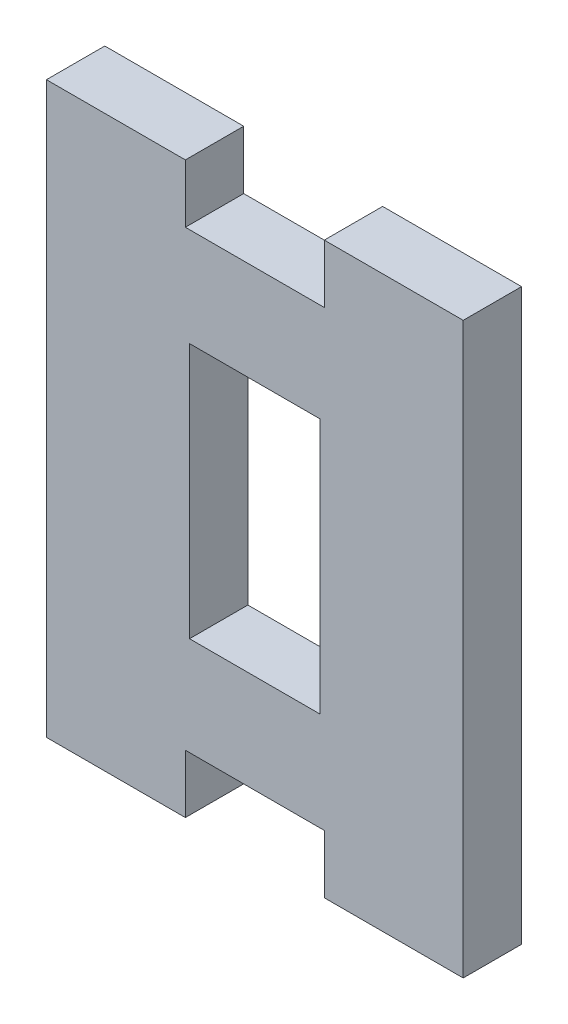
ISO-10303-21;
HEADER;
FILE_DESCRIPTION(('STEP AP214'),'2;1');
FILE_NAME('part.step','',(''),(''),'','','');
FILE_SCHEMA(('AUTOMOTIVE_DESIGN { 1 0 10303 214 1 1 1 1 }'));
ENDSEC;
DATA;
#1=APPLICATION_CONTEXT('core data for automotive mechanical design processes');
#2=APPLICATION_PROTOCOL_DEFINITION('international standard','automotive_design',2000,#1);
#3=PRODUCT_CONTEXT('',#1,'mechanical');
#4=PRODUCT('Part','Part','',(#3));
#5=PRODUCT_RELATED_PRODUCT_CATEGORY('part','',(#4));
#6=PRODUCT_DEFINITION_FORMATION('','',#4);
#7=PRODUCT_DEFINITION_CONTEXT('part definition',#1,'design');
#8=PRODUCT_DEFINITION('design','',#6,#7);
#9=PRODUCT_DEFINITION_SHAPE('','',#8);
#10=(LENGTH_UNIT() NAMED_UNIT(*) SI_UNIT(.MILLI.,.METRE.));
#11=(NAMED_UNIT(*) PLANE_ANGLE_UNIT() SI_UNIT($,.RADIAN.));
#12=(NAMED_UNIT(*) SI_UNIT($,.STERADIAN.) SOLID_ANGLE_UNIT());
#13=UNCERTAINTY_MEASURE_WITH_UNIT(LENGTH_MEASURE(1.E-05),#10,'distance_accuracy_value','');
#14=(GEOMETRIC_REPRESENTATION_CONTEXT(3) GLOBAL_UNCERTAINTY_ASSIGNED_CONTEXT((#13)) GLOBAL_UNIT_ASSIGNED_CONTEXT((#10,
#11,#12)) REPRESENTATION_CONTEXT('',''));
#15=CARTESIAN_POINT('',(0.,0.,0.));
#16=DIRECTION('',(0.,0.,1.));
#17=DIRECTION('',(1.,0.,0.));
#18=AXIS2_PLACEMENT_3D('',#15,#16,#17);
#19=CARTESIAN_POINT('',(-14.5563888248475,-48.1006763992849,5.334));
#20=DIRECTION('',(0.,1.,0.));
#21=DIRECTION('',(0.,0.,1.));
#22=AXIS2_PLACEMENT_3D('',#19,#20,#21);
#23=PLANE('',#22);
#24=DIRECTION('',(1.,0.,0.));
#25=VECTOR('',#24,1.);
#26=CARTESIAN_POINT('',(-14.5563888248475,-48.1006763992849,5.334));
#27=LINE('',#26,#25);
#28=CARTESIAN_POINT('',(10.8436111751525,-48.1006763992849,5.334));
#29=VERTEX_POINT('',#28);
#30=CARTESIAN_POINT('',(23.5436111751525,-48.1006763992849,5.334));
#31=VERTEX_POINT('',#30);
#32=EDGE_CURVE('E241',#29,#31,#27,.T.);
#33=ORIENTED_EDGE('',*,*,#32,.F.);
#34=DIRECTION('',(0.,0.,1.));
#35=VECTOR('',#34,1.);
#36=CARTESIAN_POINT('',(10.8436111751525,-48.1006763992849,0.));
#37=LINE('',#36,#35);
#38=CARTESIAN_POINT('',(10.8436111751525,-48.1006763992849,0.));
#39=VERTEX_POINT('',#38);
#40=EDGE_CURVE('E179',#39,#29,#37,.T.);
#41=ORIENTED_EDGE('',*,*,#40,.F.);
#42=DIRECTION('',(1.,0.,0.));
#43=VECTOR('',#42,1.);
#44=CARTESIAN_POINT('',(-14.5563888248475,-48.1006763992849,0.));
#45=LINE('',#44,#43);
#46=CARTESIAN_POINT('',(23.5436111751525,-48.1006763992849,0.));
#47=VERTEX_POINT('',#46);
#48=EDGE_CURVE('E255',#39,#47,#45,.T.);
#49=ORIENTED_EDGE('',*,*,#48,.T.);
#50=DIRECTION('',(0.,0.,-1.));
#51=VECTOR('',#50,1.);
#52=CARTESIAN_POINT('',(23.5436111751525,-48.1006763992849,5.334));
#53=LINE('',#52,#51);
#54=EDGE_CURVE('E43',#31,#47,#53,.T.);
#55=ORIENTED_EDGE('',*,*,#54,.F.);
#56=EDGE_LOOP('',(#33,#41,#49,#55));
#57=FACE_BOUND('',#56,.T.);
#58=ADVANCED_FACE('F35',(#57),#23,.F.);
#59=CARTESIAN_POINT('',(-14.5563888248475,3.96932360071508,5.334));
#60=DIRECTION('',(0.,-1.,0.));
#61=DIRECTION('',(0.,0.,-1.));
#62=AXIS2_PLACEMENT_3D('',#59,#60,#61);
#63=PLANE('',#62);
#64=DIRECTION('',(-1.,0.,0.));
#65=VECTOR('',#64,1.);
#66=CARTESIAN_POINT('',(-14.5563888248475,3.96932360071508,5.334));
#67=LINE('',#66,#65);
#68=CARTESIAN_POINT('',(-1.8563888248475,3.96932360071508,5.334));
#69=VERTEX_POINT('',#68);
#70=CARTESIAN_POINT('',(-14.5563888248475,3.96932360071508,5.334));
#71=VERTEX_POINT('',#70);
#72=EDGE_CURVE('E248',#69,#71,#67,.T.);
#73=ORIENTED_EDGE('',*,*,#72,.F.);
#74=DIRECTION('',(0.,0.,1.));
#75=VECTOR('',#74,1.);
#76=CARTESIAN_POINT('',(-1.8563888248475,3.96932360071508,0.));
#77=LINE('',#76,#75);
#78=CARTESIAN_POINT('',(-1.8563888248475,3.96932360071508,0.));
#79=VERTEX_POINT('',#78);
#80=EDGE_CURVE('E197',#79,#69,#77,.T.);
#81=ORIENTED_EDGE('',*,*,#80,.F.);
#82=DIRECTION('',(-1.,0.,0.));
#83=VECTOR('',#82,1.);
#84=CARTESIAN_POINT('',(-14.5563888248475,3.96932360071508,0.));
#85=LINE('',#84,#83);
#86=CARTESIAN_POINT('',(-14.5563888248475,3.96932360071508,0.));
#87=VERTEX_POINT('',#86);
#88=EDGE_CURVE('E260',#79,#87,#85,.T.);
#89=ORIENTED_EDGE('',*,*,#88,.T.);
#90=DIRECTION('',(0.,0.,-1.));
#91=VECTOR('',#90,1.);
#92=CARTESIAN_POINT('',(-14.5563888248475,3.96932360071508,5.334));
#93=LINE('',#92,#91);
#94=EDGE_CURVE('E252',#71,#87,#93,.T.);
#95=ORIENTED_EDGE('',*,*,#94,.F.);
#96=EDGE_LOOP('',(#73,#81,#89,#95));
#97=FACE_BOUND('',#96,.T.);
#98=ADVANCED_FACE('F299',(#97),#63,.F.);
#99=CARTESIAN_POINT('',(-14.5563888248475,3.96932360071508,5.334));
#100=DIRECTION('',(1.,0.,0.));
#101=DIRECTION('',(0.,1.,0.));
#102=AXIS2_PLACEMENT_3D('',#99,#100,#101);
#103=PLANE('',#102);
#104=DIRECTION('',(0.,-1.,0.));
#105=VECTOR('',#104,1.);
#106=CARTESIAN_POINT('',(-14.5563888248475,3.96932360071508,0.));
#107=LINE('',#106,#105);
#108=CARTESIAN_POINT('',(-14.5563888248475,-48.1006763992849,0.));
#109=VERTEX_POINT('',#108);
#110=EDGE_CURVE('E231',#87,#109,#107,.T.);
#111=ORIENTED_EDGE('',*,*,#110,.T.);
#112=DIRECTION('',(0.,0.,-1.));
#113=VECTOR('',#112,1.);
#114=CARTESIAN_POINT('',(-14.5563888248475,-48.1006763992849,5.334));
#115=LINE('',#114,#113);
#116=CARTESIAN_POINT('',(-14.5563888248475,-48.1006763992849,5.334));
#117=VERTEX_POINT('',#116);
#118=EDGE_CURVE('E11',#117,#109,#115,.T.);
#119=ORIENTED_EDGE('',*,*,#118,.F.);
#120=DIRECTION('',(0.,-1.,0.));
#121=VECTOR('',#120,1.);
#122=CARTESIAN_POINT('',(-14.5563888248475,3.96932360071508,5.334));
#123=LINE('',#122,#121);
#124=EDGE_CURVE('E238',#71,#117,#123,.T.);
#125=ORIENTED_EDGE('',*,*,#124,.F.);
#126=ORIENTED_EDGE('',*,*,#94,.T.);
#127=EDGE_LOOP('',(#111,#119,#125,#126));
#128=FACE_BOUND('',#127,.T.);
#129=ADVANCED_FACE('F37',(#128),#103,.F.);
#130=CARTESIAN_POINT('',(-1.85638882484751,-48.1006763992849,0.));
#131=VERTEX_POINT('',#130);
#132=EDGE_CURVE('E256',#109,#131,#45,.T.);
#133=ORIENTED_EDGE('',*,*,#132,.T.);
#134=DIRECTION('',(0.,0.,1.));
#135=VECTOR('',#134,1.);
#136=CARTESIAN_POINT('',(-1.8563888248475,-48.1006763992849,0.));
#137=LINE('',#136,#135);
#138=CARTESIAN_POINT('',(-1.8563888248475,-48.1006763992849,5.334));
#139=VERTEX_POINT('',#138);
#140=EDGE_CURVE('E50',#131,#139,#137,.T.);
#141=ORIENTED_EDGE('',*,*,#140,.T.);
#142=EDGE_CURVE('E243',#117,#139,#27,.T.);
#143=ORIENTED_EDGE('',*,*,#142,.F.);
#144=ORIENTED_EDGE('',*,*,#118,.T.);
#145=EDGE_LOOP('',(#133,#141,#143,#144));
#146=FACE_BOUND('',#145,.T.);
#147=ADVANCED_FACE('F290',(#146),#23,.F.);
#148=CARTESIAN_POINT('',(23.5436111751525,3.96932360071508,5.334));
#149=DIRECTION('',(-1.,0.,0.));
#150=DIRECTION('',(0.,-1.,0.));
#151=AXIS2_PLACEMENT_3D('',#148,#149,#150);
#152=PLANE('',#151);
#153=DIRECTION('',(0.,1.,0.));
#154=VECTOR('',#153,1.);
#155=CARTESIAN_POINT('',(23.5436111751525,3.96932360071508,0.));
#156=LINE('',#155,#154);
#157=CARTESIAN_POINT('',(23.5436111751525,3.96932360071508,0.));
#158=VERTEX_POINT('',#157);
#159=EDGE_CURVE('E258',#47,#158,#156,.T.);
#160=ORIENTED_EDGE('',*,*,#159,.T.);
#161=DIRECTION('',(0.,0.,-1.));
#162=VECTOR('',#161,1.);
#163=CARTESIAN_POINT('',(23.5436111751525,3.96932360071508,5.334));
#164=LINE('',#163,#162);
#165=CARTESIAN_POINT('',(23.5436111751525,3.96932360071508,5.334));
#166=VERTEX_POINT('',#165);
#167=EDGE_CURVE('E265',#166,#158,#164,.T.);
#168=ORIENTED_EDGE('',*,*,#167,.F.);
#169=DIRECTION('',(0.,1.,0.));
#170=VECTOR('',#169,1.);
#171=CARTESIAN_POINT('',(23.5436111751525,3.96932360071508,5.334));
#172=LINE('',#171,#170);
#173=EDGE_CURVE('E246',#31,#166,#172,.T.);
#174=ORIENTED_EDGE('',*,*,#173,.F.);
#175=ORIENTED_EDGE('',*,*,#54,.T.);
#176=EDGE_LOOP('',(#160,#168,#174,#175));
#177=FACE_BOUND('',#176,.T.);
#178=ADVANCED_FACE('F272',(#177),#152,.F.);
#179=CARTESIAN_POINT('',(10.8436111751525,3.96932360071508,0.));
#180=VERTEX_POINT('',#179);
#181=EDGE_CURVE('E242',#158,#180,#85,.T.);
#182=ORIENTED_EDGE('',*,*,#181,.T.);
#183=DIRECTION('',(0.,0.,1.));
#184=VECTOR('',#183,1.);
#185=CARTESIAN_POINT('',(10.8436111751525,3.96932360071508,0.));
#186=LINE('',#185,#184);
#187=CARTESIAN_POINT('',(10.8436111751525,3.96932360071508,5.334));
#188=VERTEX_POINT('',#187);
#189=EDGE_CURVE('E200',#180,#188,#186,.T.);
#190=ORIENTED_EDGE('',*,*,#189,.T.);
#191=EDGE_CURVE('E249',#166,#188,#67,.T.);
#192=ORIENTED_EDGE('',*,*,#191,.F.);
#193=ORIENTED_EDGE('',*,*,#167,.T.);
#194=EDGE_LOOP('',(#182,#190,#192,#193));
#195=FACE_BOUND('',#194,.T.);
#196=ADVANCED_FACE('F278',(#195),#63,.F.);
#197=CARTESIAN_POINT('',(0.,0.,5.334));
#198=DIRECTION('',(0.,0.,1.));
#199=DIRECTION('',(1.,0.,0.));
#200=AXIS2_PLACEMENT_3D('',#197,#198,#199);
#201=PLANE('',#200);
#202=DIRECTION('',(0.,1.,0.));
#203=VECTOR('',#202,1.);
#204=CARTESIAN_POINT('',(10.8436111751525,-48.1006763992849,5.334));
#205=LINE('',#204,#203);
#206=CARTESIAN_POINT('',(10.8436111751525,-42.7666763992849,5.334));
#207=VERTEX_POINT('',#206);
#208=EDGE_CURVE('E167',#29,#207,#205,.T.);
#209=ORIENTED_EDGE('',*,*,#208,.F.);
#210=ORIENTED_EDGE('',*,*,#32,.T.);
#211=ORIENTED_EDGE('',*,*,#173,.T.);
#212=ORIENTED_EDGE('',*,*,#191,.T.);
#213=DIRECTION('',(0.,1.,0.));
#214=VECTOR('',#213,1.);
#215=CARTESIAN_POINT('',(10.8436111751525,3.96932360071508,5.334));
#216=LINE('',#215,#214);
#217=CARTESIAN_POINT('',(10.8436111751525,-1.36467639928492,5.334));
#218=VERTEX_POINT('',#217);
#219=EDGE_CURVE('E186',#218,#188,#216,.T.);
#220=ORIENTED_EDGE('',*,*,#219,.F.);
#221=DIRECTION('',(1.,0.,0.));
#222=VECTOR('',#221,1.);
#223=CARTESIAN_POINT('',(-1.8563888248475,-1.36467639928492,5.334));
#224=LINE('',#223,#222);
#225=CARTESIAN_POINT('',(-1.8563888248475,-1.36467639928492,5.334));
#226=VERTEX_POINT('',#225);
#227=EDGE_CURVE('E193',#226,#218,#224,.T.);
#228=ORIENTED_EDGE('',*,*,#227,.F.);
#229=DIRECTION('',(0.,-1.,0.));
#230=VECTOR('',#229,1.);
#231=CARTESIAN_POINT('',(-1.8563888248475,3.96932360071508,5.334));
#232=LINE('',#231,#230);
#233=EDGE_CURVE('E178',#69,#226,#232,.T.);
#234=ORIENTED_EDGE('',*,*,#233,.F.);
#235=ORIENTED_EDGE('',*,*,#72,.T.);
#236=ORIENTED_EDGE('',*,*,#124,.T.);
#237=ORIENTED_EDGE('',*,*,#142,.T.);
#238=DIRECTION('',(0.,-1.,0.));
#239=VECTOR('',#238,1.);
#240=CARTESIAN_POINT('',(-1.8563888248475,-48.1006763992849,5.334));
#241=LINE('',#240,#239);
#242=CARTESIAN_POINT('',(-1.8563888248475,-42.7666763992849,5.334));
#243=VERTEX_POINT('',#242);
#244=EDGE_CURVE('E170',#243,#139,#241,.T.);
#245=ORIENTED_EDGE('',*,*,#244,.F.);
#246=DIRECTION('',(-1.,0.,0.));
#247=VECTOR('',#246,1.);
#248=CARTESIAN_POINT('',(-1.8563888248475,-42.7666763992849,5.334));
#249=LINE('',#248,#247);
#250=EDGE_CURVE('E155',#207,#243,#249,.T.);
#251=ORIENTED_EDGE('',*,*,#250,.F.);
#252=EDGE_LOOP('',(#209,#210,#211,#212,#220,#228,#234,#235,#236,#237,#245,#251));
#253=FACE_BOUND('',#252,.T.);
#254=DIRECTION('',(0.,1.,0.));
#255=VECTOR('',#254,1.);
#256=CARTESIAN_POINT('',(10.4626111751525,-33.7496763992849,5.334));
#257=LINE('',#256,#255);
#258=CARTESIAN_POINT('',(10.4626111751525,-33.7496763992849,5.334));
#259=VERTEX_POINT('',#258);
#260=CARTESIAN_POINT('',(10.4626111751525,-10.3816763992849,5.334));
#261=VERTEX_POINT('',#260);
#262=EDGE_CURVE('E199',#259,#261,#257,.T.);
#263=ORIENTED_EDGE('',*,*,#262,.F.);
#264=DIRECTION('',(1.,0.,0.));
#265=VECTOR('',#264,1.);
#266=CARTESIAN_POINT('',(-1.4753888248475,-33.7496763992849,5.334));
#267=LINE('',#266,#265);
#268=CARTESIAN_POINT('',(-1.4753888248475,-33.7496763992849,5.334));
#269=VERTEX_POINT('',#268);
#270=EDGE_CURVE('E210',#269,#259,#267,.T.);
#271=ORIENTED_EDGE('',*,*,#270,.F.);
#272=DIRECTION('',(0.,-1.,0.));
#273=VECTOR('',#272,1.);
#274=CARTESIAN_POINT('',(-1.4753888248475,-33.7496763992849,5.334));
#275=LINE('',#274,#273);
#276=CARTESIAN_POINT('',(-1.4753888248475,-10.3816763992849,5.334));
#277=VERTEX_POINT('',#276);
#278=EDGE_CURVE('E224',#277,#269,#275,.T.);
#279=ORIENTED_EDGE('',*,*,#278,.F.);
#280=DIRECTION('',(-1.,0.,0.));
#281=VECTOR('',#280,1.);
#282=CARTESIAN_POINT('',(-1.4753888248475,-10.3816763992849,5.334));
#283=LINE('',#282,#281);
#284=EDGE_CURVE('E221',#261,#277,#283,.T.);
#285=ORIENTED_EDGE('',*,*,#284,.F.);
#286=EDGE_LOOP('',(#263,#271,#279,#285));
#287=FACE_BOUND('',#286,.T.);
#288=ADVANCED_FACE('F283',(#253,#287),#201,.T.);
#289=CARTESIAN_POINT('',(0.,0.,0.));
#290=DIRECTION('',(0.,0.,1.));
#291=DIRECTION('',(1.,0.,0.));
#292=AXIS2_PLACEMENT_3D('',#289,#290,#291);
#293=PLANE('',#292);
#294=ORIENTED_EDGE('',*,*,#48,.F.);
#295=DIRECTION('',(0.,1.,0.));
#296=VECTOR('',#295,1.);
#297=CARTESIAN_POINT('',(10.8436111751525,-48.1006763992849,0.));
#298=LINE('',#297,#296);
#299=CARTESIAN_POINT('',(10.8436111751525,-42.7666763992849,0.));
#300=VERTEX_POINT('',#299);
#301=EDGE_CURVE('E157',#39,#300,#298,.T.);
#302=ORIENTED_EDGE('',*,*,#301,.T.);
#303=DIRECTION('',(-1.,0.,0.));
#304=VECTOR('',#303,1.);
#305=CARTESIAN_POINT('',(-1.8563888248475,-42.7666763992849,0.));
#306=LINE('',#305,#304);
#307=CARTESIAN_POINT('',(-1.8563888248475,-42.7666763992849,0.));
#308=VERTEX_POINT('',#307);
#309=EDGE_CURVE('E152',#300,#308,#306,.T.);
#310=ORIENTED_EDGE('',*,*,#309,.T.);
#311=DIRECTION('',(0.,-1.,0.));
#312=VECTOR('',#311,1.);
#313=CARTESIAN_POINT('',(-1.8563888248475,-48.1006763992849,0.));
#314=LINE('',#313,#312);
#315=EDGE_CURVE('E159',#308,#131,#314,.T.);
#316=ORIENTED_EDGE('',*,*,#315,.T.);
#317=ORIENTED_EDGE('',*,*,#132,.F.);
#318=ORIENTED_EDGE('',*,*,#110,.F.);
#319=ORIENTED_EDGE('',*,*,#88,.F.);
#320=DIRECTION('',(0.,-1.,0.));
#321=VECTOR('',#320,1.);
#322=CARTESIAN_POINT('',(-1.8563888248475,3.96932360071508,0.));
#323=LINE('',#322,#321);
#324=CARTESIAN_POINT('',(-1.8563888248475,-1.36467639928492,0.));
#325=VERTEX_POINT('',#324);
#326=EDGE_CURVE('E182',#79,#325,#323,.T.);
#327=ORIENTED_EDGE('',*,*,#326,.T.);
#328=DIRECTION('',(1.,0.,0.));
#329=VECTOR('',#328,1.);
#330=CARTESIAN_POINT('',(-1.8563888248475,-1.36467639928492,0.));
#331=LINE('',#330,#329);
#332=CARTESIAN_POINT('',(10.8436111751525,-1.36467639928492,0.));
#333=VERTEX_POINT('',#332);
#334=EDGE_CURVE('E185',#325,#333,#331,.T.);
#335=ORIENTED_EDGE('',*,*,#334,.T.);
#336=DIRECTION('',(0.,1.,0.));
#337=VECTOR('',#336,1.);
#338=CARTESIAN_POINT('',(10.8436111751525,3.96932360071508,0.));
#339=LINE('',#338,#337);
#340=EDGE_CURVE('E58',#333,#180,#339,.T.);
#341=ORIENTED_EDGE('',*,*,#340,.T.);
#342=ORIENTED_EDGE('',*,*,#181,.F.);
#343=ORIENTED_EDGE('',*,*,#159,.F.);
#344=EDGE_LOOP('',(#294,#302,#310,#316,#317,#318,#319,#327,#335,#341,#342,#343));
#345=FACE_BOUND('',#344,.T.);
#346=DIRECTION('',(1.,0.,0.));
#347=VECTOR('',#346,1.);
#348=CARTESIAN_POINT('',(-1.4753888248475,-33.7496763992849,0.));
#349=LINE('',#348,#347);
#350=CARTESIAN_POINT('',(-1.4753888248475,-33.7496763992849,0.));
#351=VERTEX_POINT('',#350);
#352=CARTESIAN_POINT('',(10.4626111751525,-33.7496763992849,0.));
#353=VERTEX_POINT('',#352);
#354=EDGE_CURVE('E216',#351,#353,#349,.T.);
#355=ORIENTED_EDGE('',*,*,#354,.T.);
#356=DIRECTION('',(0.,1.,0.));
#357=VECTOR('',#356,1.);
#358=CARTESIAN_POINT('',(10.4626111751525,-33.7496763992849,0.));
#359=LINE('',#358,#357);
#360=CARTESIAN_POINT('',(10.4626111751525,-10.3816763992849,0.));
#361=VERTEX_POINT('',#360);
#362=EDGE_CURVE('E206',#353,#361,#359,.T.);
#363=ORIENTED_EDGE('',*,*,#362,.T.);
#364=DIRECTION('',(-1.,0.,0.));
#365=VECTOR('',#364,1.);
#366=CARTESIAN_POINT('',(-1.4753888248475,-10.3816763992849,0.));
#367=LINE('',#366,#365);
#368=CARTESIAN_POINT('',(-1.4753888248475,-10.3816763992849,0.));
#369=VERTEX_POINT('',#368);
#370=EDGE_CURVE('E209',#361,#369,#367,.T.);
#371=ORIENTED_EDGE('',*,*,#370,.T.);
#372=DIRECTION('',(0.,-1.,0.));
#373=VECTOR('',#372,1.);
#374=CARTESIAN_POINT('',(-1.4753888248475,-33.7496763992849,0.));
#375=LINE('',#374,#373);
#376=EDGE_CURVE('E213',#369,#351,#375,.T.);
#377=ORIENTED_EDGE('',*,*,#376,.T.);
#378=EDGE_LOOP('',(#355,#363,#371,#377));
#379=FACE_BOUND('',#378,.T.);
#380=ADVANCED_FACE('F165',(#345,#379),#293,.F.);
#381=CARTESIAN_POINT('',(10.4626111751525,-33.7496763992849,0.));
#382=DIRECTION('',(1.,0.,0.));
#383=DIRECTION('',(0.,0.,-1.));
#384=AXIS2_PLACEMENT_3D('',#381,#382,#383);
#385=PLANE('',#384);
#386=ORIENTED_EDGE('',*,*,#262,.T.);
#387=DIRECTION('',(0.,0.,1.));
#388=VECTOR('',#387,1.);
#389=CARTESIAN_POINT('',(10.4626111751525,-10.3816763992849,0.));
#390=LINE('',#389,#388);
#391=EDGE_CURVE('E219',#361,#261,#390,.T.);
#392=ORIENTED_EDGE('',*,*,#391,.F.);
#393=ORIENTED_EDGE('',*,*,#362,.F.);
#394=DIRECTION('',(0.,0.,1.));
#395=VECTOR('',#394,1.);
#396=CARTESIAN_POINT('',(10.4626111751525,-33.7496763992849,0.));
#397=LINE('',#396,#395);
#398=EDGE_CURVE('E229',#353,#259,#397,.T.);
#399=ORIENTED_EDGE('',*,*,#398,.T.);
#400=EDGE_LOOP('',(#386,#392,#393,#399));
#401=FACE_BOUND('',#400,.T.);
#402=ADVANCED_FACE('F369',(#401),#385,.F.);
#403=CARTESIAN_POINT('',(-1.4753888248475,-33.7496763992849,0.));
#404=DIRECTION('',(0.,-1.,0.));
#405=DIRECTION('',(0.,0.,-1.));
#406=AXIS2_PLACEMENT_3D('',#403,#404,#405);
#407=PLANE('',#406);
#408=ORIENTED_EDGE('',*,*,#270,.T.);
#409=ORIENTED_EDGE('',*,*,#398,.F.);
#410=ORIENTED_EDGE('',*,*,#354,.F.);
#411=DIRECTION('',(0.,0.,1.));
#412=VECTOR('',#411,1.);
#413=CARTESIAN_POINT('',(-1.4753888248475,-33.7496763992849,0.));
#414=LINE('',#413,#412);
#415=EDGE_CURVE('E232',#351,#269,#414,.T.);
#416=ORIENTED_EDGE('',*,*,#415,.T.);
#417=EDGE_LOOP('',(#408,#409,#410,#416));
#418=FACE_BOUND('',#417,.T.);
#419=ADVANCED_FACE('F424',(#418),#407,.F.);
#420=CARTESIAN_POINT('',(-1.4753888248475,-33.7496763992849,0.));
#421=DIRECTION('',(-1.,0.,0.));
#422=DIRECTION('',(0.,0.,1.));
#423=AXIS2_PLACEMENT_3D('',#420,#421,#422);
#424=PLANE('',#423);
#425=ORIENTED_EDGE('',*,*,#278,.T.);
#426=ORIENTED_EDGE('',*,*,#415,.F.);
#427=ORIENTED_EDGE('',*,*,#376,.F.);
#428=DIRECTION('',(0.,0.,1.));
#429=VECTOR('',#428,1.);
#430=CARTESIAN_POINT('',(-1.4753888248475,-10.3816763992849,0.));
#431=LINE('',#430,#429);
#432=EDGE_CURVE('E234',#369,#277,#431,.T.);
#433=ORIENTED_EDGE('',*,*,#432,.T.);
#434=EDGE_LOOP('',(#425,#426,#427,#433));
#435=FACE_BOUND('',#434,.T.);
#436=ADVANCED_FACE('F417',(#435),#424,.F.);
#437=CARTESIAN_POINT('',(-1.4753888248475,-10.3816763992849,0.));
#438=DIRECTION('',(0.,1.,0.));
#439=DIRECTION('',(0.,0.,1.));
#440=AXIS2_PLACEMENT_3D('',#437,#438,#439);
#441=PLANE('',#440);
#442=ORIENTED_EDGE('',*,*,#284,.T.);
#443=ORIENTED_EDGE('',*,*,#432,.F.);
#444=ORIENTED_EDGE('',*,*,#370,.F.);
#445=ORIENTED_EDGE('',*,*,#391,.T.);
#446=EDGE_LOOP('',(#442,#443,#444,#445));
#447=FACE_BOUND('',#446,.T.);
#448=ADVANCED_FACE('F315',(#447),#441,.F.);
#449=CARTESIAN_POINT('',(-1.8563888248475,3.96932360071508,0.));
#450=DIRECTION('',(-1.,0.,0.));
#451=DIRECTION('',(0.,-1.,0.));
#452=AXIS2_PLACEMENT_3D('',#449,#450,#451);
#453=PLANE('',#452);
#454=ORIENTED_EDGE('',*,*,#233,.T.);
#455=DIRECTION('',(0.,0.,1.));
#456=VECTOR('',#455,1.);
#457=CARTESIAN_POINT('',(-1.8563888248475,-1.36467639928492,0.));
#458=LINE('',#457,#456);
#459=EDGE_CURVE('E190',#325,#226,#458,.T.);
#460=ORIENTED_EDGE('',*,*,#459,.F.);
#461=ORIENTED_EDGE('',*,*,#326,.F.);
#462=ORIENTED_EDGE('',*,*,#80,.T.);
#463=EDGE_LOOP('',(#454,#460,#461,#462));
#464=FACE_BOUND('',#463,.T.);
#465=ADVANCED_FACE('F303',(#464),#453,.F.);
#466=CARTESIAN_POINT('',(10.8436111751525,3.96932360071508,0.));
#467=DIRECTION('',(1.,0.,0.));
#468=DIRECTION('',(0.,0.,-1.));
#469=AXIS2_PLACEMENT_3D('',#466,#467,#468);
#470=PLANE('',#469);
#471=ORIENTED_EDGE('',*,*,#219,.T.);
#472=ORIENTED_EDGE('',*,*,#189,.F.);
#473=ORIENTED_EDGE('',*,*,#340,.F.);
#474=DIRECTION('',(0.,0.,1.));
#475=VECTOR('',#474,1.);
#476=CARTESIAN_POINT('',(10.8436111751525,-1.36467639928492,0.));
#477=LINE('',#476,#475);
#478=EDGE_CURVE('E203',#333,#218,#477,.T.);
#479=ORIENTED_EDGE('',*,*,#478,.T.);
#480=EDGE_LOOP('',(#471,#472,#473,#479));
#481=FACE_BOUND('',#480,.T.);
#482=ADVANCED_FACE('F307',(#481),#470,.F.);
#483=CARTESIAN_POINT('',(-1.8563888248475,-1.36467639928492,0.));
#484=DIRECTION('',(0.,-1.,0.));
#485=DIRECTION('',(0.,0.,-1.));
#486=AXIS2_PLACEMENT_3D('',#483,#484,#485);
#487=PLANE('',#486);
#488=ORIENTED_EDGE('',*,*,#227,.T.);
#489=ORIENTED_EDGE('',*,*,#478,.F.);
#490=ORIENTED_EDGE('',*,*,#334,.F.);
#491=ORIENTED_EDGE('',*,*,#459,.T.);
#492=EDGE_LOOP('',(#488,#489,#490,#491));
#493=FACE_BOUND('',#492,.T.);
#494=ADVANCED_FACE('F305',(#493),#487,.F.);
#495=CARTESIAN_POINT('',(-1.8563888248475,-42.7666763992849,0.));
#496=DIRECTION('',(0.,1.,0.));
#497=DIRECTION('',(0.,0.,1.));
#498=AXIS2_PLACEMENT_3D('',#495,#496,#497);
#499=PLANE('',#498);
#500=ORIENTED_EDGE('',*,*,#250,.T.);
#501=DIRECTION('',(0.,0.,1.));
#502=VECTOR('',#501,1.);
#503=CARTESIAN_POINT('',(-1.8563888248475,-42.7666763992849,0.));
#504=LINE('',#503,#502);
#505=EDGE_CURVE('E149',#308,#243,#504,.T.);
#506=ORIENTED_EDGE('',*,*,#505,.F.);
#507=ORIENTED_EDGE('',*,*,#309,.F.);
#508=DIRECTION('',(0.,0.,1.));
#509=VECTOR('',#508,1.);
#510=CARTESIAN_POINT('',(10.8436111751525,-42.7666763992849,0.));
#511=LINE('',#510,#509);
#512=EDGE_CURVE('E176',#300,#207,#511,.T.);
#513=ORIENTED_EDGE('',*,*,#512,.T.);
#514=EDGE_LOOP('',(#500,#506,#507,#513));
#515=FACE_BOUND('',#514,.T.);
#516=ADVANCED_FACE('F150',(#515),#499,.F.);
#517=CARTESIAN_POINT('',(10.8436111751525,-48.1006763992849,0.));
#518=DIRECTION('',(1.,0.,0.));
#519=DIRECTION('',(0.,0.,-1.));
#520=AXIS2_PLACEMENT_3D('',#517,#518,#519);
#521=PLANE('',#520);
#522=ORIENTED_EDGE('',*,*,#208,.T.);
#523=ORIENTED_EDGE('',*,*,#512,.F.);
#524=ORIENTED_EDGE('',*,*,#301,.F.);
#525=ORIENTED_EDGE('',*,*,#40,.T.);
#526=EDGE_LOOP('',(#522,#523,#524,#525));
#527=FACE_BOUND('',#526,.T.);
#528=ADVANCED_FACE('F288',(#527),#521,.F.);
#529=CARTESIAN_POINT('',(-1.8563888248475,-48.1006763992849,0.));
#530=DIRECTION('',(-1.,0.,0.));
#531=DIRECTION('',(0.,-1.,0.));
#532=AXIS2_PLACEMENT_3D('',#529,#530,#531);
#533=PLANE('',#532);
#534=ORIENTED_EDGE('',*,*,#244,.T.);
#535=ORIENTED_EDGE('',*,*,#140,.F.);
#536=ORIENTED_EDGE('',*,*,#315,.F.);
#537=ORIENTED_EDGE('',*,*,#505,.T.);
#538=EDGE_LOOP('',(#534,#535,#536,#537));
#539=FACE_BOUND('',#538,.T.);
#540=ADVANCED_FACE('F160',(#539),#533,.F.);
#541=CLOSED_SHELL('',(#58,#98,#129,#147,#178,#196,#288,#380,#402,#419,#436,#448,#465,#482,#494,
#516,#528,#540));
#542=MANIFOLD_SOLID_BREP('B2',#541);
#543=ADVANCED_BREP_SHAPE_REPRESENTATION('',(#18,#542),#14);
#544=SHAPE_DEFINITION_REPRESENTATION(#9,#543);
ENDSEC;
END-ISO-10303-21;
